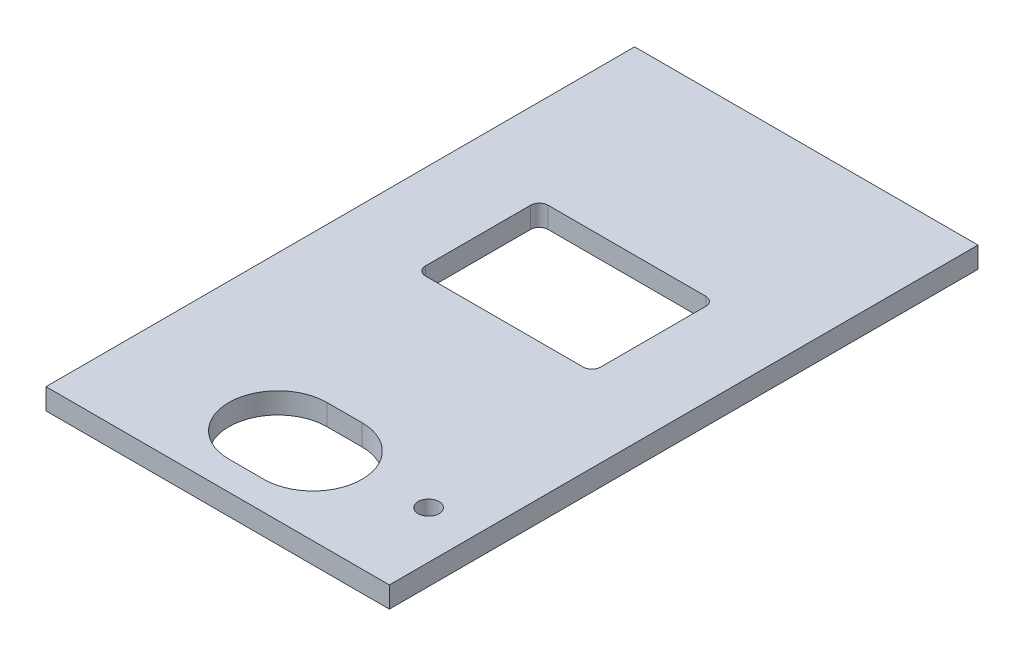
ISO-10303-21;
HEADER;
FILE_DESCRIPTION(('STEP AP214'),'2;1');
FILE_NAME('part.step','',(''),(''),'','','');
FILE_SCHEMA(('AUTOMOTIVE_DESIGN { 1 0 10303 214 1 1 1 1 }'));
ENDSEC;
DATA;
#1=APPLICATION_CONTEXT('core data for automotive mechanical design processes');
#2=APPLICATION_PROTOCOL_DEFINITION('international standard','automotive_design',2000,#1);
#3=PRODUCT_CONTEXT('',#1,'mechanical');
#4=PRODUCT('Part','Part','',(#3));
#5=PRODUCT_RELATED_PRODUCT_CATEGORY('part','',(#4));
#6=PRODUCT_DEFINITION_FORMATION('','',#4);
#7=PRODUCT_DEFINITION_CONTEXT('part definition',#1,'design');
#8=PRODUCT_DEFINITION('design','',#6,#7);
#9=PRODUCT_DEFINITION_SHAPE('','',#8);
#10=(LENGTH_UNIT() NAMED_UNIT(*) SI_UNIT(.MILLI.,.METRE.));
#11=(NAMED_UNIT(*) PLANE_ANGLE_UNIT() SI_UNIT($,.RADIAN.));
#12=(NAMED_UNIT(*) SI_UNIT($,.STERADIAN.) SOLID_ANGLE_UNIT());
#13=UNCERTAINTY_MEASURE_WITH_UNIT(LENGTH_MEASURE(1.E-05),#10,'distance_accuracy_value','');
#14=(GEOMETRIC_REPRESENTATION_CONTEXT(3) GLOBAL_UNCERTAINTY_ASSIGNED_CONTEXT((#13)) GLOBAL_UNIT_ASSIGNED_CONTEXT((#10,
#11,#12)) REPRESENTATION_CONTEXT('',''));
#15=CARTESIAN_POINT('',(0.,0.,0.));
#16=DIRECTION('',(0.,0.,1.));
#17=DIRECTION('',(1.,0.,0.));
#18=AXIS2_PLACEMENT_3D('',#15,#16,#17);
#19=CARTESIAN_POINT('',(-98.,12.,168.));
#20=DIRECTION('',(1.,0.,0.));
#21=DIRECTION('',(0.,0.,-1.));
#22=AXIS2_PLACEMENT_3D('',#19,#20,#21);
#23=PLANE('',#22);
#24=DIRECTION('',(0.,0.,1.));
#25=VECTOR('',#24,1.);
#26=CARTESIAN_POINT('',(-98.,0.,168.));
#27=LINE('',#26,#25);
#28=CARTESIAN_POINT('',(-98.,0.,-168.));
#29=VERTEX_POINT('',#28);
#30=CARTESIAN_POINT('',(-98.,0.,168.));
#31=VERTEX_POINT('',#30);
#32=EDGE_CURVE('E242',#29,#31,#27,.T.);
#33=ORIENTED_EDGE('',*,*,#32,.T.);
#34=DIRECTION('',(0.,-1.,0.));
#35=VECTOR('',#34,1.);
#36=CARTESIAN_POINT('',(-98.,12.,168.));
#37=LINE('',#36,#35);
#38=CARTESIAN_POINT('',(-98.,12.,168.));
#39=VERTEX_POINT('',#38);
#40=EDGE_CURVE('E11',#39,#31,#37,.T.);
#41=ORIENTED_EDGE('',*,*,#40,.F.);
#42=DIRECTION('',(0.,0.,1.));
#43=VECTOR('',#42,1.);
#44=CARTESIAN_POINT('',(-98.,12.,168.));
#45=LINE('',#44,#43);
#46=CARTESIAN_POINT('',(-98.,12.,-168.));
#47=VERTEX_POINT('',#46);
#48=EDGE_CURVE('E249',#47,#39,#45,.T.);
#49=ORIENTED_EDGE('',*,*,#48,.F.);
#50=DIRECTION('',(0.,-1.,0.));
#51=VECTOR('',#50,1.);
#52=CARTESIAN_POINT('',(-98.,12.,-168.));
#53=LINE('',#52,#51);
#54=EDGE_CURVE('E259',#47,#29,#53,.T.);
#55=ORIENTED_EDGE('',*,*,#54,.T.);
#56=EDGE_LOOP('',(#33,#41,#49,#55));
#57=FACE_BOUND('',#56,.T.);
#58=ADVANCED_FACE('F33',(#57),#23,.F.);
#59=CARTESIAN_POINT('',(98.,12.,168.));
#60=DIRECTION('',(0.,0.,-1.));
#61=DIRECTION('',(-1.,0.,0.));
#62=AXIS2_PLACEMENT_3D('',#59,#60,#61);
#63=PLANE('',#62);
#64=DIRECTION('',(1.,0.,0.));
#65=VECTOR('',#64,1.);
#66=CARTESIAN_POINT('',(98.,0.,168.));
#67=LINE('',#66,#65);
#68=CARTESIAN_POINT('',(98.,0.,168.));
#69=VERTEX_POINT('',#68);
#70=EDGE_CURVE('E262',#31,#69,#67,.T.);
#71=ORIENTED_EDGE('',*,*,#70,.T.);
#72=DIRECTION('',(0.,-1.,0.));
#73=VECTOR('',#72,1.);
#74=CARTESIAN_POINT('',(98.,12.,168.));
#75=LINE('',#74,#73);
#76=CARTESIAN_POINT('',(98.,12.,168.));
#77=VERTEX_POINT('',#76);
#78=EDGE_CURVE('E41',#77,#69,#75,.T.);
#79=ORIENTED_EDGE('',*,*,#78,.F.);
#80=DIRECTION('',(1.,0.,0.));
#81=VECTOR('',#80,1.);
#82=CARTESIAN_POINT('',(98.,12.,168.));
#83=LINE('',#82,#81);
#84=EDGE_CURVE('E252',#39,#77,#83,.T.);
#85=ORIENTED_EDGE('',*,*,#84,.F.);
#86=ORIENTED_EDGE('',*,*,#40,.T.);
#87=EDGE_LOOP('',(#71,#79,#85,#86));
#88=FACE_BOUND('',#87,.T.);
#89=ADVANCED_FACE('F292',(#88),#63,.F.);
#90=CARTESIAN_POINT('',(98.,12.,168.));
#91=DIRECTION('',(-1.,0.,0.));
#92=DIRECTION('',(0.,0.,1.));
#93=AXIS2_PLACEMENT_3D('',#90,#91,#92);
#94=PLANE('',#93);
#95=DIRECTION('',(0.,0.,-1.));
#96=VECTOR('',#95,1.);
#97=CARTESIAN_POINT('',(98.,0.,168.));
#98=LINE('',#97,#96);
#99=CARTESIAN_POINT('',(98.,0.,-168.));
#100=VERTEX_POINT('',#99);
#101=EDGE_CURVE('E264',#69,#100,#98,.T.);
#102=ORIENTED_EDGE('',*,*,#101,.T.);
#103=DIRECTION('',(0.,-1.,0.));
#104=VECTOR('',#103,1.);
#105=CARTESIAN_POINT('',(98.,12.,-168.));
#106=LINE('',#105,#104);
#107=CARTESIAN_POINT('',(98.,12.,-168.));
#108=VERTEX_POINT('',#107);
#109=EDGE_CURVE('E269',#108,#100,#106,.T.);
#110=ORIENTED_EDGE('',*,*,#109,.F.);
#111=DIRECTION('',(0.,0.,-1.));
#112=VECTOR('',#111,1.);
#113=CARTESIAN_POINT('',(98.,12.,168.));
#114=LINE('',#113,#112);
#115=EDGE_CURVE('E255',#77,#108,#114,.T.);
#116=ORIENTED_EDGE('',*,*,#115,.F.);
#117=ORIENTED_EDGE('',*,*,#78,.T.);
#118=EDGE_LOOP('',(#102,#110,#116,#117));
#119=FACE_BOUND('',#118,.T.);
#120=ADVANCED_FACE('F277',(#119),#94,.F.);
#121=CARTESIAN_POINT('',(98.,12.,-168.));
#122=DIRECTION('',(0.,0.,1.));
#123=DIRECTION('',(1.,0.,0.));
#124=AXIS2_PLACEMENT_3D('',#121,#122,#123);
#125=PLANE('',#124);
#126=DIRECTION('',(-1.,0.,0.));
#127=VECTOR('',#126,1.);
#128=CARTESIAN_POINT('',(98.,0.,-168.));
#129=LINE('',#128,#127);
#130=EDGE_CURVE('E253',#100,#29,#129,.T.);
#131=ORIENTED_EDGE('',*,*,#130,.T.);
#132=ORIENTED_EDGE('',*,*,#54,.F.);
#133=DIRECTION('',(-1.,0.,0.));
#134=VECTOR('',#133,1.);
#135=CARTESIAN_POINT('',(98.,12.,-168.));
#136=LINE('',#135,#134);
#137=EDGE_CURVE('E257',#108,#47,#136,.T.);
#138=ORIENTED_EDGE('',*,*,#137,.F.);
#139=ORIENTED_EDGE('',*,*,#109,.T.);
#140=EDGE_LOOP('',(#131,#132,#138,#139));
#141=FACE_BOUND('',#140,.T.);
#142=ADVANCED_FACE('F285',(#141),#125,.F.);
#143=CARTESIAN_POINT('',(0.,12.,0.));
#144=DIRECTION('',(0.,1.,0.));
#145=DIRECTION('',(0.,0.,1.));
#146=AXIS2_PLACEMENT_3D('',#143,#144,#145);
#147=PLANE('',#146);
#148=CARTESIAN_POINT('',(71.,12.,118.61257922072));
#149=DIRECTION('',(0.,1.,0.));
#150=DIRECTION('',(0.,0.,1.));
#151=AXIS2_PLACEMENT_3D('',#148,#149,#150);
#152=CIRCLE('',#151,6.);
#153=CARTESIAN_POINT('',(71.,12.,124.61257922072));
#154=VERTEX_POINT('',#153);
#155=EDGE_CURVE('E171',#154,#154,#152,.T.);
#156=ORIENTED_EDGE('',*,*,#155,.F.);
#157=EDGE_LOOP('',(#156));
#158=FACE_BOUND('',#157,.T.);
#159=CARTESIAN_POINT('',(-44.3939185942755,12.,0.));
#160=DIRECTION('',(0.,1.,0.));
#161=DIRECTION('',(0.,0.,-1.));
#162=AXIS2_PLACEMENT_3D('',#159,#160,#161);
#163=CIRCLE('',#162,5.);
#164=CARTESIAN_POINT('',(-49.3939185942755,12.,0.));
#165=VERTEX_POINT('',#164);
#166=CARTESIAN_POINT('',(-44.3939185942754,12.,5.00000000000001));
#167=VERTEX_POINT('',#166);
#168=EDGE_CURVE('E48',#165,#167,#163,.T.);
#169=ORIENTED_EDGE('',*,*,#168,.F.);
#170=DIRECTION('',(0.,0.,1.));
#171=VECTOR('',#170,1.);
#172=CARTESIAN_POINT('',(-49.3939185942755,12.,0.));
#173=LINE('',#172,#171);
#174=CARTESIAN_POINT('',(-49.3939185942755,12.,-60.));
#175=VERTEX_POINT('',#174);
#176=EDGE_CURVE('E165',#175,#165,#173,.T.);
#177=ORIENTED_EDGE('',*,*,#176,.F.);
#178=CARTESIAN_POINT('',(-44.3939185942755,12.,-60.));
#179=DIRECTION('',(0.,1.,0.));
#180=DIRECTION('',(0.,0.,1.));
#181=AXIS2_PLACEMENT_3D('',#178,#179,#180);
#182=CIRCLE('',#181,5.);
#183=CARTESIAN_POINT('',(-44.3939185942754,12.,-65.));
#184=VERTEX_POINT('',#183);
#185=EDGE_CURVE('E168',#184,#175,#182,.T.);
#186=ORIENTED_EDGE('',*,*,#185,.F.);
#187=DIRECTION('',(-1.,0.,0.));
#188=VECTOR('',#187,1.);
#189=CARTESIAN_POINT('',(45.6060814057245,12.,-65.));
#190=LINE('',#189,#188);
#191=CARTESIAN_POINT('',(45.6060814057245,12.,-65.));
#192=VERTEX_POINT('',#191);
#193=EDGE_CURVE('E198',#192,#184,#190,.T.);
#194=ORIENTED_EDGE('',*,*,#193,.F.);
#195=CARTESIAN_POINT('',(45.6060814057245,12.,-60.));
#196=DIRECTION('',(0.,1.,0.));
#197=DIRECTION('',(0.,0.,1.));
#198=AXIS2_PLACEMENT_3D('',#195,#196,#197);
#199=CIRCLE('',#198,5.);
#200=CARTESIAN_POINT('',(50.6060814057245,12.,-60.));
#201=VERTEX_POINT('',#200);
#202=EDGE_CURVE('E195',#201,#192,#199,.T.);
#203=ORIENTED_EDGE('',*,*,#202,.F.);
#204=DIRECTION('',(0.,0.,-1.));
#205=VECTOR('',#204,1.);
#206=CARTESIAN_POINT('',(50.6060814057245,12.,0.));
#207=LINE('',#206,#205);
#208=CARTESIAN_POINT('',(50.6060814057245,12.,0.));
#209=VERTEX_POINT('',#208);
#210=EDGE_CURVE('E192',#209,#201,#207,.T.);
#211=ORIENTED_EDGE('',*,*,#210,.F.);
#212=CARTESIAN_POINT('',(45.6060814057245,12.,0.));
#213=DIRECTION('',(0.,1.,0.));
#214=DIRECTION('',(0.,0.,1.));
#215=AXIS2_PLACEMENT_3D('',#212,#213,#214);
#216=CIRCLE('',#215,5.);
#217=CARTESIAN_POINT('',(45.6060814057245,12.,5.));
#218=VERTEX_POINT('',#217);
#219=EDGE_CURVE('E189',#218,#209,#216,.T.);
#220=ORIENTED_EDGE('',*,*,#219,.F.);
#221=DIRECTION('',(1.,0.,0.));
#222=VECTOR('',#221,1.);
#223=CARTESIAN_POINT('',(45.6060814057245,12.,5.));
#224=LINE('',#223,#222);
#225=EDGE_CURVE('E187',#167,#218,#224,.T.);
#226=ORIENTED_EDGE('',*,*,#225,.F.);
#227=EDGE_LOOP('',(#169,#177,#186,#194,#203,#211,#220,#226));
#228=FACE_BOUND('',#227,.T.);
#229=CARTESIAN_POINT('',(-9.99999999999998,12.,123.61257922072));
#230=DIRECTION('',(0.,1.,0.));
#231=DIRECTION('',(0.,0.,1.));
#232=AXIS2_PLACEMENT_3D('',#229,#230,#231);
#233=CIRCLE('',#232,28.);
#234=CARTESIAN_POINT('',(-9.99999999999998,12.,95.6125792207199));
#235=VERTEX_POINT('',#234);
#236=CARTESIAN_POINT('',(-9.99999999999998,12.,151.61257922072));
#237=VERTEX_POINT('',#236);
#238=EDGE_CURVE('E205',#235,#237,#233,.T.);
#239=ORIENTED_EDGE('',*,*,#238,.F.);
#240=DIRECTION('',(-1.,0.,0.));
#241=VECTOR('',#240,1.);
#242=CARTESIAN_POINT('',(10.,12.,95.6125792207199));
#243=LINE('',#242,#241);
#244=CARTESIAN_POINT('',(10.,12.,95.6125792207199));
#245=VERTEX_POINT('',#244);
#246=EDGE_CURVE('E221',#245,#235,#243,.T.);
#247=ORIENTED_EDGE('',*,*,#246,.F.);
#248=CARTESIAN_POINT('',(10.,12.,123.61257922072));
#249=DIRECTION('',(0.,1.,0.));
#250=DIRECTION('',(0.,0.,1.));
#251=AXIS2_PLACEMENT_3D('',#248,#249,#250);
#252=CIRCLE('',#251,28.);
#253=CARTESIAN_POINT('',(10.,12.,151.61257922072));
#254=VERTEX_POINT('',#253);
#255=EDGE_CURVE('E235',#254,#245,#252,.T.);
#256=ORIENTED_EDGE('',*,*,#255,.F.);
#257=DIRECTION('',(1.,0.,0.));
#258=VECTOR('',#257,1.);
#259=CARTESIAN_POINT('',(10.,12.,151.61257922072));
#260=LINE('',#259,#258);
#261=EDGE_CURVE('E232',#237,#254,#260,.T.);
#262=ORIENTED_EDGE('',*,*,#261,.F.);
#263=EDGE_LOOP('',(#239,#247,#256,#262));
#264=FACE_BOUND('',#263,.T.);
#265=ORIENTED_EDGE('',*,*,#48,.T.);
#266=ORIENTED_EDGE('',*,*,#84,.T.);
#267=ORIENTED_EDGE('',*,*,#115,.T.);
#268=ORIENTED_EDGE('',*,*,#137,.T.);
#269=EDGE_LOOP('',(#265,#266,#267,#268));
#270=FACE_BOUND('',#269,.T.);
#271=ADVANCED_FACE('F291',(#158,#228,#264,#270),#147,.T.);
#272=CARTESIAN_POINT('',(0.,0.,0.));
#273=DIRECTION('',(0.,1.,0.));
#274=DIRECTION('',(0.,0.,1.));
#275=AXIS2_PLACEMENT_3D('',#272,#273,#274);
#276=PLANE('',#275);
#277=CARTESIAN_POINT('',(71.,0.,118.61257922072));
#278=DIRECTION('',(0.,1.,0.));
#279=DIRECTION('',(0.,0.,1.));
#280=AXIS2_PLACEMENT_3D('',#277,#278,#279);
#281=CIRCLE('',#280,6.);
#282=CARTESIAN_POINT('',(71.,0.,124.61257922072));
#283=VERTEX_POINT('',#282);
#284=EDGE_CURVE('E36',#283,#283,#281,.T.);
#285=ORIENTED_EDGE('',*,*,#284,.T.);
#286=EDGE_LOOP('',(#285));
#287=FACE_BOUND('',#286,.T.);
#288=DIRECTION('',(0.,0.,1.));
#289=VECTOR('',#288,1.);
#290=CARTESIAN_POINT('',(-49.3939185942755,0.,0.));
#291=LINE('',#290,#289);
#292=CARTESIAN_POINT('',(-49.3939185942755,0.,-60.));
#293=VERTEX_POINT('',#292);
#294=CARTESIAN_POINT('',(-49.3939185942755,0.,0.));
#295=VERTEX_POINT('',#294);
#296=EDGE_CURVE('E154',#293,#295,#291,.T.);
#297=ORIENTED_EDGE('',*,*,#296,.T.);
#298=CARTESIAN_POINT('',(-44.3939185942755,0.,0.));
#299=DIRECTION('',(0.,1.,0.));
#300=DIRECTION('',(0.,0.,-1.));
#301=AXIS2_PLACEMENT_3D('',#298,#299,#300);
#302=CIRCLE('',#301,5.);
#303=CARTESIAN_POINT('',(-44.3939185942754,0.,5.00000000000001));
#304=VERTEX_POINT('',#303);
#305=EDGE_CURVE('E148',#295,#304,#302,.T.);
#306=ORIENTED_EDGE('',*,*,#305,.T.);
#307=DIRECTION('',(1.,0.,0.));
#308=VECTOR('',#307,1.);
#309=CARTESIAN_POINT('',(45.6060814057245,0.,5.));
#310=LINE('',#309,#308);
#311=CARTESIAN_POINT('',(45.6060814057245,0.,5.));
#312=VERTEX_POINT('',#311);
#313=EDGE_CURVE('E157',#304,#312,#310,.T.);
#314=ORIENTED_EDGE('',*,*,#313,.T.);
#315=CARTESIAN_POINT('',(45.6060814057245,0.,0.));
#316=DIRECTION('',(0.,1.,0.));
#317=DIRECTION('',(0.,0.,1.));
#318=AXIS2_PLACEMENT_3D('',#315,#316,#317);
#319=CIRCLE('',#318,5.);
#320=CARTESIAN_POINT('',(50.6060814057245,0.,0.));
#321=VERTEX_POINT('',#320);
#322=EDGE_CURVE('E56',#312,#321,#319,.T.);
#323=ORIENTED_EDGE('',*,*,#322,.T.);
#324=DIRECTION('',(0.,0.,-1.));
#325=VECTOR('',#324,1.);
#326=CARTESIAN_POINT('',(50.6060814057245,0.,0.));
#327=LINE('',#326,#325);
#328=CARTESIAN_POINT('',(50.6060814057245,0.,-60.));
#329=VERTEX_POINT('',#328);
#330=EDGE_CURVE('E174',#321,#329,#327,.T.);
#331=ORIENTED_EDGE('',*,*,#330,.T.);
#332=CARTESIAN_POINT('',(45.6060814057245,0.,-60.));
#333=DIRECTION('',(0.,1.,0.));
#334=DIRECTION('',(0.,0.,1.));
#335=AXIS2_PLACEMENT_3D('',#332,#333,#334);
#336=CIRCLE('',#335,5.);
#337=CARTESIAN_POINT('',(45.6060814057245,0.,-65.));
#338=VERTEX_POINT('',#337);
#339=EDGE_CURVE('E177',#329,#338,#336,.T.);
#340=ORIENTED_EDGE('',*,*,#339,.T.);
#341=DIRECTION('',(-1.,0.,0.));
#342=VECTOR('',#341,1.);
#343=CARTESIAN_POINT('',(45.6060814057245,0.,-65.));
#344=LINE('',#343,#342);
#345=CARTESIAN_POINT('',(-44.3939185942754,0.,-65.));
#346=VERTEX_POINT('',#345);
#347=EDGE_CURVE('E180',#338,#346,#344,.T.);
#348=ORIENTED_EDGE('',*,*,#347,.T.);
#349=CARTESIAN_POINT('',(-44.3939185942755,0.,-60.));
#350=DIRECTION('',(0.,1.,0.));
#351=DIRECTION('',(0.,0.,1.));
#352=AXIS2_PLACEMENT_3D('',#349,#350,#351);
#353=CIRCLE('',#352,5.);
#354=EDGE_CURVE('E183',#346,#293,#353,.T.);
#355=ORIENTED_EDGE('',*,*,#354,.T.);
#356=EDGE_LOOP('',(#297,#306,#314,#323,#331,#340,#348,#355));
#357=FACE_BOUND('',#356,.T.);
#358=DIRECTION('',(-1.,0.,0.));
#359=VECTOR('',#358,1.);
#360=CARTESIAN_POINT('',(10.,0.,95.6125792207199));
#361=LINE('',#360,#359);
#362=CARTESIAN_POINT('',(10.,0.,95.6125792207199));
#363=VERTEX_POINT('',#362);
#364=CARTESIAN_POINT('',(-9.99999999999998,0.,95.6125792207199));
#365=VERTEX_POINT('',#364);
#366=EDGE_CURVE('E227',#363,#365,#361,.T.);
#367=ORIENTED_EDGE('',*,*,#366,.T.);
#368=CARTESIAN_POINT('',(-9.99999999999998,0.,123.61257922072));
#369=DIRECTION('',(0.,1.,0.));
#370=DIRECTION('',(0.,0.,1.));
#371=AXIS2_PLACEMENT_3D('',#368,#369,#370);
#372=CIRCLE('',#371,28.);
#373=CARTESIAN_POINT('',(-9.99999999999998,0.,151.61257922072));
#374=VERTEX_POINT('',#373);
#375=EDGE_CURVE('E217',#365,#374,#372,.T.);
#376=ORIENTED_EDGE('',*,*,#375,.T.);
#377=DIRECTION('',(1.,0.,0.));
#378=VECTOR('',#377,1.);
#379=CARTESIAN_POINT('',(10.,0.,151.61257922072));
#380=LINE('',#379,#378);
#381=CARTESIAN_POINT('',(10.,0.,151.61257922072));
#382=VERTEX_POINT('',#381);
#383=EDGE_CURVE('E220',#374,#382,#380,.T.);
#384=ORIENTED_EDGE('',*,*,#383,.T.);
#385=CARTESIAN_POINT('',(10.,0.,123.61257922072));
#386=DIRECTION('',(0.,1.,0.));
#387=DIRECTION('',(0.,0.,1.));
#388=AXIS2_PLACEMENT_3D('',#385,#386,#387);
#389=CIRCLE('',#388,28.);
#390=EDGE_CURVE('E224',#382,#363,#389,.T.);
#391=ORIENTED_EDGE('',*,*,#390,.T.);
#392=EDGE_LOOP('',(#367,#376,#384,#391));
#393=FACE_BOUND('',#392,.T.);
#394=ORIENTED_EDGE('',*,*,#32,.F.);
#395=ORIENTED_EDGE('',*,*,#130,.F.);
#396=ORIENTED_EDGE('',*,*,#101,.F.);
#397=ORIENTED_EDGE('',*,*,#70,.F.);
#398=EDGE_LOOP('',(#394,#395,#396,#397));
#399=FACE_BOUND('',#398,.T.);
#400=ADVANCED_FACE('F161',(#287,#357,#393,#399),#276,.F.);
#401=CARTESIAN_POINT('',(-9.99999999999998,0.,123.61257922072));
#402=DIRECTION('',(0.,1.,0.));
#403=DIRECTION('',(0.,0.,1.));
#404=AXIS2_PLACEMENT_3D('',#401,#402,#403);
#405=CYLINDRICAL_SURFACE('',#404,28.);
#406=ORIENTED_EDGE('',*,*,#238,.T.);
#407=DIRECTION('',(0.,1.,0.));
#408=VECTOR('',#407,1.);
#409=CARTESIAN_POINT('',(-9.99999999999998,0.,151.61257922072));
#410=LINE('',#409,#408);
#411=EDGE_CURVE('E230',#374,#237,#410,.T.);
#412=ORIENTED_EDGE('',*,*,#411,.F.);
#413=ORIENTED_EDGE('',*,*,#375,.F.);
#414=DIRECTION('',(0.,1.,0.));
#415=VECTOR('',#414,1.);
#416=CARTESIAN_POINT('',(-9.99999999999998,0.,95.6125792207199));
#417=LINE('',#416,#415);
#418=EDGE_CURVE('E240',#365,#235,#417,.T.);
#419=ORIENTED_EDGE('',*,*,#418,.T.);
#420=EDGE_LOOP('',(#406,#412,#413,#419));
#421=FACE_BOUND('',#420,.T.);
#422=ADVANCED_FACE('F304',(#421),#405,.F.);
#423=CARTESIAN_POINT('',(10.,0.,95.6125792207199));
#424=DIRECTION('',(0.,0.,-1.));
#425=DIRECTION('',(-1.,0.,0.));
#426=AXIS2_PLACEMENT_3D('',#423,#424,#425);
#427=PLANE('',#426);
#428=ORIENTED_EDGE('',*,*,#246,.T.);
#429=ORIENTED_EDGE('',*,*,#418,.F.);
#430=ORIENTED_EDGE('',*,*,#366,.F.);
#431=DIRECTION('',(0.,1.,0.));
#432=VECTOR('',#431,1.);
#433=CARTESIAN_POINT('',(10.,0.,95.6125792207199));
#434=LINE('',#433,#432);
#435=EDGE_CURVE('E243',#363,#245,#434,.T.);
#436=ORIENTED_EDGE('',*,*,#435,.T.);
#437=EDGE_LOOP('',(#428,#429,#430,#436));
#438=FACE_BOUND('',#437,.T.);
#439=ADVANCED_FACE('F311',(#438),#427,.F.);
#440=CARTESIAN_POINT('',(10.,0.,123.61257922072));
#441=DIRECTION('',(0.,1.,0.));
#442=DIRECTION('',(0.,0.,1.));
#443=AXIS2_PLACEMENT_3D('',#440,#441,#442);
#444=CYLINDRICAL_SURFACE('',#443,28.);
#445=ORIENTED_EDGE('',*,*,#255,.T.);
#446=ORIENTED_EDGE('',*,*,#435,.F.);
#447=ORIENTED_EDGE('',*,*,#390,.F.);
#448=DIRECTION('',(0.,1.,0.));
#449=VECTOR('',#448,1.);
#450=CARTESIAN_POINT('',(10.,0.,151.61257922072));
#451=LINE('',#450,#449);
#452=EDGE_CURVE('E245',#382,#254,#451,.T.);
#453=ORIENTED_EDGE('',*,*,#452,.T.);
#454=EDGE_LOOP('',(#445,#446,#447,#453));
#455=FACE_BOUND('',#454,.T.);
#456=ADVANCED_FACE('F316',(#455),#444,.F.);
#457=CARTESIAN_POINT('',(10.,0.,151.61257922072));
#458=DIRECTION('',(0.,0.,1.));
#459=DIRECTION('',(1.,0.,0.));
#460=AXIS2_PLACEMENT_3D('',#457,#458,#459);
#461=PLANE('',#460);
#462=ORIENTED_EDGE('',*,*,#261,.T.);
#463=ORIENTED_EDGE('',*,*,#452,.F.);
#464=ORIENTED_EDGE('',*,*,#383,.F.);
#465=ORIENTED_EDGE('',*,*,#411,.T.);
#466=EDGE_LOOP('',(#462,#463,#464,#465));
#467=FACE_BOUND('',#466,.T.);
#468=ADVANCED_FACE('F313',(#467),#461,.F.);
#469=CARTESIAN_POINT('',(-44.3939185942755,0.,0.));
#470=DIRECTION('',(0.,1.,0.));
#471=DIRECTION('',(0.,0.,1.));
#472=AXIS2_PLACEMENT_3D('',#469,#470,#471);
#473=CYLINDRICAL_SURFACE('',#472,5.);
#474=ORIENTED_EDGE('',*,*,#168,.T.);
#475=DIRECTION('',(0.,1.,0.));
#476=VECTOR('',#475,1.);
#477=CARTESIAN_POINT('',(-44.3939185942754,0.,5.00000000000001));
#478=LINE('',#477,#476);
#479=EDGE_CURVE('E144',#304,#167,#478,.T.);
#480=ORIENTED_EDGE('',*,*,#479,.F.);
#481=ORIENTED_EDGE('',*,*,#305,.F.);
#482=DIRECTION('',(0.,1.,0.));
#483=VECTOR('',#482,1.);
#484=CARTESIAN_POINT('',(-49.3939185942755,0.,0.));
#485=LINE('',#484,#483);
#486=EDGE_CURVE('E203',#295,#165,#485,.T.);
#487=ORIENTED_EDGE('',*,*,#486,.T.);
#488=EDGE_LOOP('',(#474,#480,#481,#487));
#489=FACE_BOUND('',#488,.T.);
#490=ADVANCED_FACE('F146',(#489),#473,.F.);
#491=CARTESIAN_POINT('',(-49.3939185942755,0.,0.));
#492=DIRECTION('',(-1.,0.,0.));
#493=DIRECTION('',(0.,0.,1.));
#494=AXIS2_PLACEMENT_3D('',#491,#492,#493);
#495=PLANE('',#494);
#496=ORIENTED_EDGE('',*,*,#176,.T.);
#497=ORIENTED_EDGE('',*,*,#486,.F.);
#498=ORIENTED_EDGE('',*,*,#296,.F.);
#499=DIRECTION('',(0.,1.,0.));
#500=VECTOR('',#499,1.);
#501=CARTESIAN_POINT('',(-49.3939185942755,0.,-60.));
#502=LINE('',#501,#500);
#503=EDGE_CURVE('E206',#293,#175,#502,.T.);
#504=ORIENTED_EDGE('',*,*,#503,.T.);
#505=EDGE_LOOP('',(#496,#497,#498,#504));
#506=FACE_BOUND('',#505,.T.);
#507=ADVANCED_FACE('F326',(#506),#495,.F.);
#508=CARTESIAN_POINT('',(-44.3939185942755,0.,-60.));
#509=DIRECTION('',(0.,1.,0.));
#510=DIRECTION('',(0.,0.,1.));
#511=AXIS2_PLACEMENT_3D('',#508,#509,#510);
#512=CYLINDRICAL_SURFACE('',#511,5.);
#513=ORIENTED_EDGE('',*,*,#185,.T.);
#514=ORIENTED_EDGE('',*,*,#503,.F.);
#515=ORIENTED_EDGE('',*,*,#354,.F.);
#516=DIRECTION('',(0.,1.,0.));
#517=VECTOR('',#516,1.);
#518=CARTESIAN_POINT('',(-44.3939185942754,0.,-65.));
#519=LINE('',#518,#517);
#520=EDGE_CURVE('E208',#346,#184,#519,.T.);
#521=ORIENTED_EDGE('',*,*,#520,.T.);
#522=EDGE_LOOP('',(#513,#514,#515,#521));
#523=FACE_BOUND('',#522,.T.);
#524=ADVANCED_FACE('F344',(#523),#512,.F.);
#525=CARTESIAN_POINT('',(45.6060814057245,0.,-65.));
#526=DIRECTION('',(0.,0.,-1.));
#527=DIRECTION('',(-1.,0.,0.));
#528=AXIS2_PLACEMENT_3D('',#525,#526,#527);
#529=PLANE('',#528);
#530=ORIENTED_EDGE('',*,*,#193,.T.);
#531=ORIENTED_EDGE('',*,*,#520,.F.);
#532=ORIENTED_EDGE('',*,*,#347,.F.);
#533=DIRECTION('',(0.,1.,0.));
#534=VECTOR('',#533,1.);
#535=CARTESIAN_POINT('',(45.6060814057245,0.,-65.));
#536=LINE('',#535,#534);
#537=EDGE_CURVE('E210',#338,#192,#536,.T.);
#538=ORIENTED_EDGE('',*,*,#537,.T.);
#539=EDGE_LOOP('',(#530,#531,#532,#538));
#540=FACE_BOUND('',#539,.T.);
#541=ADVANCED_FACE('F340',(#540),#529,.F.);
#542=CARTESIAN_POINT('',(45.6060814057245,0.,-60.));
#543=DIRECTION('',(0.,1.,0.));
#544=DIRECTION('',(0.,0.,1.));
#545=AXIS2_PLACEMENT_3D('',#542,#543,#544);
#546=CYLINDRICAL_SURFACE('',#545,5.);
#547=ORIENTED_EDGE('',*,*,#202,.T.);
#548=ORIENTED_EDGE('',*,*,#537,.F.);
#549=ORIENTED_EDGE('',*,*,#339,.F.);
#550=DIRECTION('',(0.,1.,0.));
#551=VECTOR('',#550,1.);
#552=CARTESIAN_POINT('',(50.6060814057245,0.,-60.));
#553=LINE('',#552,#551);
#554=EDGE_CURVE('E212',#329,#201,#553,.T.);
#555=ORIENTED_EDGE('',*,*,#554,.T.);
#556=EDGE_LOOP('',(#547,#548,#549,#555));
#557=FACE_BOUND('',#556,.T.);
#558=ADVANCED_FACE('F336',(#557),#546,.F.);
#559=CARTESIAN_POINT('',(50.6060814057245,0.,0.));
#560=DIRECTION('',(1.,0.,0.));
#561=DIRECTION('',(0.,0.,-1.));
#562=AXIS2_PLACEMENT_3D('',#559,#560,#561);
#563=PLANE('',#562);
#564=ORIENTED_EDGE('',*,*,#210,.T.);
#565=ORIENTED_EDGE('',*,*,#554,.F.);
#566=ORIENTED_EDGE('',*,*,#330,.F.);
#567=DIRECTION('',(0.,1.,0.));
#568=VECTOR('',#567,1.);
#569=CARTESIAN_POINT('',(50.6060814057245,0.,0.));
#570=LINE('',#569,#568);
#571=EDGE_CURVE('E214',#321,#209,#570,.T.);
#572=ORIENTED_EDGE('',*,*,#571,.T.);
#573=EDGE_LOOP('',(#564,#565,#566,#572));
#574=FACE_BOUND('',#573,.T.);
#575=ADVANCED_FACE('F333',(#574),#563,.F.);
#576=CARTESIAN_POINT('',(45.6060814057245,0.,0.));
#577=DIRECTION('',(0.,1.,0.));
#578=DIRECTION('',(0.,0.,1.));
#579=AXIS2_PLACEMENT_3D('',#576,#577,#578);
#580=CYLINDRICAL_SURFACE('',#579,5.);
#581=ORIENTED_EDGE('',*,*,#219,.T.);
#582=ORIENTED_EDGE('',*,*,#571,.F.);
#583=ORIENTED_EDGE('',*,*,#322,.F.);
#584=DIRECTION('',(0.,1.,0.));
#585=VECTOR('',#584,1.);
#586=CARTESIAN_POINT('',(45.6060814057245,0.,5.));
#587=LINE('',#586,#585);
#588=EDGE_CURVE('E153',#312,#218,#587,.T.);
#589=ORIENTED_EDGE('',*,*,#588,.T.);
#590=EDGE_LOOP('',(#581,#582,#583,#589));
#591=FACE_BOUND('',#590,.T.);
#592=ADVANCED_FACE('F330',(#591),#580,.F.);
#593=CARTESIAN_POINT('',(45.6060814057245,0.,5.));
#594=DIRECTION('',(0.,0.,1.));
#595=DIRECTION('',(1.,0.,0.));
#596=AXIS2_PLACEMENT_3D('',#593,#594,#595);
#597=PLANE('',#596);
#598=ORIENTED_EDGE('',*,*,#225,.T.);
#599=ORIENTED_EDGE('',*,*,#588,.F.);
#600=ORIENTED_EDGE('',*,*,#313,.F.);
#601=ORIENTED_EDGE('',*,*,#479,.T.);
#602=EDGE_LOOP('',(#598,#599,#600,#601));
#603=FACE_BOUND('',#602,.T.);
#604=ADVANCED_FACE('F158',(#603),#597,.F.);
#605=CARTESIAN_POINT('',(71.,-61.,118.61257922072));
#606=DIRECTION('',(0.,1.,0.));
#607=DIRECTION('',(0.,0.,1.));
#608=AXIS2_PLACEMENT_3D('',#605,#606,#607);
#609=CYLINDRICAL_SURFACE('',#608,6.);
#610=ORIENTED_EDGE('',*,*,#155,.T.);
#611=EDGE_LOOP('',(#610));
#612=FACE_BOUND('',#611,.T.);
#613=ORIENTED_EDGE('',*,*,#284,.F.);
#614=EDGE_LOOP('',(#613));
#615=FACE_BOUND('',#614,.T.);
#616=ADVANCED_FACE('F329',(#612,#615),#609,.F.);
#617=CLOSED_SHELL('',(#58,#89,#120,#142,#271,#400,#422,#439,#456,#468,#490,#507,#524,#541,#558,
#575,#592,#604,#616));
#618=MANIFOLD_SOLID_BREP('B2',#617);
#619=ADVANCED_BREP_SHAPE_REPRESENTATION('',(#18,#618),#14);
#620=SHAPE_DEFINITION_REPRESENTATION(#9,#619);
ENDSEC;
END-ISO-10303-21;
